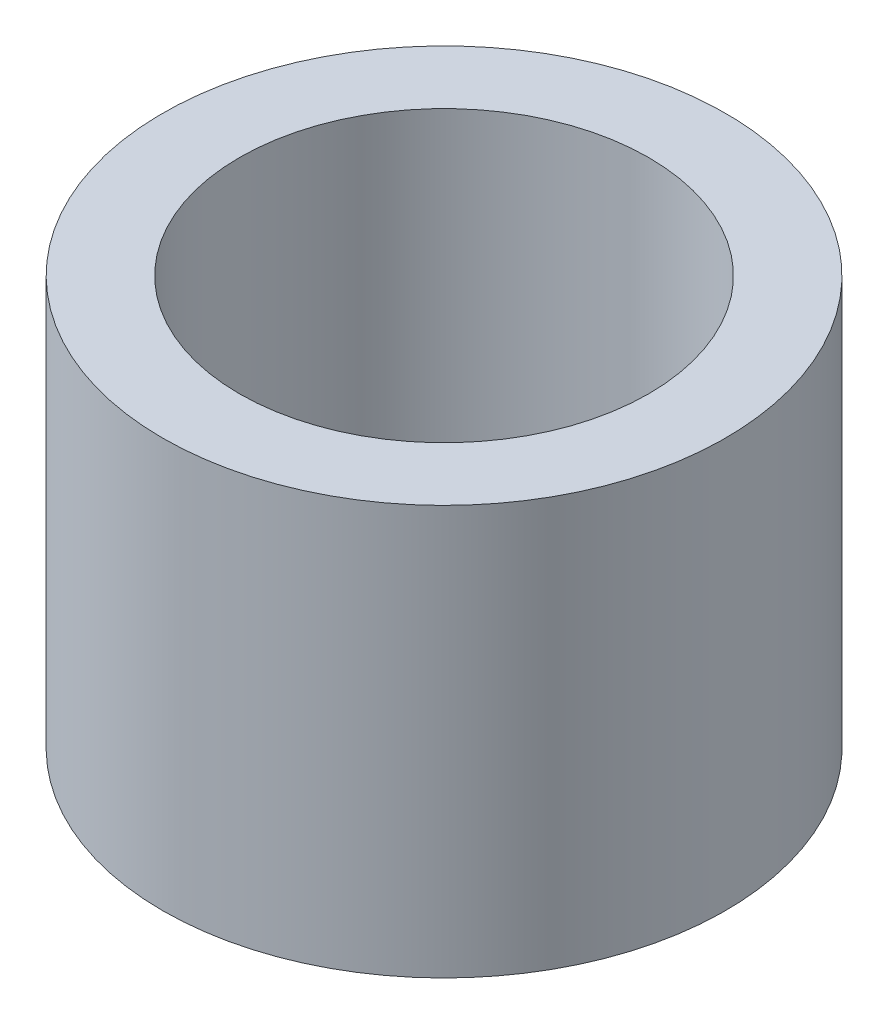
ISO-10303-21;
HEADER;
FILE_DESCRIPTION(('STEP AP214'),'2;1');
FILE_NAME('part.step','',(''),(''),'','','');
FILE_SCHEMA(('AUTOMOTIVE_DESIGN { 1 0 10303 214 1 1 1 1 }'));
ENDSEC;
DATA;
#1=APPLICATION_CONTEXT('core data for automotive mechanical design processes');
#2=APPLICATION_PROTOCOL_DEFINITION('international standard','automotive_design',2000,#1);
#3=PRODUCT_CONTEXT('',#1,'mechanical');
#4=PRODUCT('Part','Part','',(#3));
#5=PRODUCT_RELATED_PRODUCT_CATEGORY('part','',(#4));
#6=PRODUCT_DEFINITION_FORMATION('','',#4);
#7=PRODUCT_DEFINITION_CONTEXT('part definition',#1,'design');
#8=PRODUCT_DEFINITION('design','',#6,#7);
#9=PRODUCT_DEFINITION_SHAPE('','',#8);
#10=(LENGTH_UNIT() NAMED_UNIT(*) SI_UNIT(.MILLI.,.METRE.));
#11=(NAMED_UNIT(*) PLANE_ANGLE_UNIT() SI_UNIT($,.RADIAN.));
#12=(NAMED_UNIT(*) SI_UNIT($,.STERADIAN.) SOLID_ANGLE_UNIT());
#13=UNCERTAINTY_MEASURE_WITH_UNIT(LENGTH_MEASURE(1.E-05),#10,'distance_accuracy_value','');
#14=(GEOMETRIC_REPRESENTATION_CONTEXT(3) GLOBAL_UNCERTAINTY_ASSIGNED_CONTEXT((#13)) GLOBAL_UNIT_ASSIGNED_CONTEXT((#10,
#11,#12)) REPRESENTATION_CONTEXT('',''));
#15=CARTESIAN_POINT('',(0.,0.,0.));
#16=DIRECTION('',(0.,0.,1.));
#17=DIRECTION('',(1.,0.,0.));
#18=AXIS2_PLACEMENT_3D('',#15,#16,#17);
#19=CARTESIAN_POINT('',(0.,8.,0.));
#20=DIRECTION('',(0.,1.,0.));
#21=DIRECTION('',(0.,0.,1.));
#22=AXIS2_PLACEMENT_3D('',#19,#20,#21);
#23=PLANE('',#22);
#24=CARTESIAN_POINT('',(0.,8.,0.));
#25=DIRECTION('',(0.,1.,0.));
#26=DIRECTION('',(0.,0.,1.));
#27=AXIS2_PLACEMENT_3D('',#24,#25,#26);
#28=CIRCLE('',#27,5.5);
#29=CARTESIAN_POINT('',(0.,8.,5.5));
#30=VERTEX_POINT('',#29);
#31=EDGE_CURVE('E10',#30,#30,#28,.T.);
#32=ORIENTED_EDGE('',*,*,#31,.T.);
#33=EDGE_LOOP('',(#32));
#34=FACE_BOUND('',#33,.T.);
#35=CARTESIAN_POINT('',(0.,8.,0.));
#36=DIRECTION('',(0.,1.,0.));
#37=DIRECTION('',(0.,0.,1.));
#38=AXIS2_PLACEMENT_3D('',#35,#36,#37);
#39=CIRCLE('',#38,4.);
#40=CARTESIAN_POINT('',(0.,8.,4.));
#41=VERTEX_POINT('',#40);
#42=EDGE_CURVE('E54',#41,#41,#39,.T.);
#43=ORIENTED_EDGE('',*,*,#42,.F.);
#44=EDGE_LOOP('',(#43));
#45=FACE_BOUND('',#44,.T.);
#46=ADVANCED_FACE('F40',(#34,#45),#23,.T.);
#47=CARTESIAN_POINT('',(0.,0.,0.));
#48=DIRECTION('',(0.,1.,0.));
#49=DIRECTION('',(0.,0.,1.));
#50=AXIS2_PLACEMENT_3D('',#47,#48,#49);
#51=PLANE('',#50);
#52=CARTESIAN_POINT('',(0.,0.,0.));
#53=DIRECTION('',(0.,1.,0.));
#54=DIRECTION('',(0.,0.,1.));
#55=AXIS2_PLACEMENT_3D('',#52,#53,#54);
#56=CIRCLE('',#55,5.5);
#57=CARTESIAN_POINT('',(0.,0.,5.5));
#58=VERTEX_POINT('',#57);
#59=EDGE_CURVE('E44',#58,#58,#56,.T.);
#60=ORIENTED_EDGE('',*,*,#59,.F.);
#61=EDGE_LOOP('',(#60));
#62=FACE_BOUND('',#61,.T.);
#63=CARTESIAN_POINT('',(0.,0.,0.));
#64=DIRECTION('',(0.,1.,0.));
#65=DIRECTION('',(0.,0.,1.));
#66=AXIS2_PLACEMENT_3D('',#63,#64,#65);
#67=CIRCLE('',#66,4.);
#68=CARTESIAN_POINT('',(0.,0.,4.));
#69=VERTEX_POINT('',#68);
#70=EDGE_CURVE('E56',#69,#69,#67,.T.);
#71=ORIENTED_EDGE('',*,*,#70,.T.);
#72=EDGE_LOOP('',(#71));
#73=FACE_BOUND('',#72,.T.);
#74=ADVANCED_FACE('F67',(#62,#73),#51,.F.);
#75=CARTESIAN_POINT('',(0.,8.,0.));
#76=DIRECTION('',(0.,-1.,0.));
#77=DIRECTION('',(0.,0.,-1.));
#78=AXIS2_PLACEMENT_3D('',#75,#76,#77);
#79=CYLINDRICAL_SURFACE('',#78,5.5);
#80=ORIENTED_EDGE('',*,*,#31,.F.);
#81=EDGE_LOOP('',(#80));
#82=FACE_BOUND('',#81,.T.);
#83=ORIENTED_EDGE('',*,*,#59,.T.);
#84=EDGE_LOOP('',(#83));
#85=FACE_BOUND('',#84,.T.);
#86=ADVANCED_FACE('F42',(#82,#85),#79,.T.);
#87=CARTESIAN_POINT('',(0.,8.,0.));
#88=DIRECTION('',(0.,-1.,0.));
#89=DIRECTION('',(0.,0.,-1.));
#90=AXIS2_PLACEMENT_3D('',#87,#88,#89);
#91=CYLINDRICAL_SURFACE('',#90,4.);
#92=ORIENTED_EDGE('',*,*,#42,.T.);
#93=EDGE_LOOP('',(#92));
#94=FACE_BOUND('',#93,.T.);
#95=ORIENTED_EDGE('',*,*,#70,.F.);
#96=EDGE_LOOP('',(#95));
#97=FACE_BOUND('',#96,.T.);
#98=ADVANCED_FACE('F63',(#94,#97),#91,.F.);
#99=CLOSED_SHELL('',(#46,#74,#86,#98));
#100=MANIFOLD_SOLID_BREP('B2',#99);
#101=ADVANCED_BREP_SHAPE_REPRESENTATION('',(#18,#100),#14);
#102=SHAPE_DEFINITION_REPRESENTATION(#9,#101);
ENDSEC;
END-ISO-10303-21;
